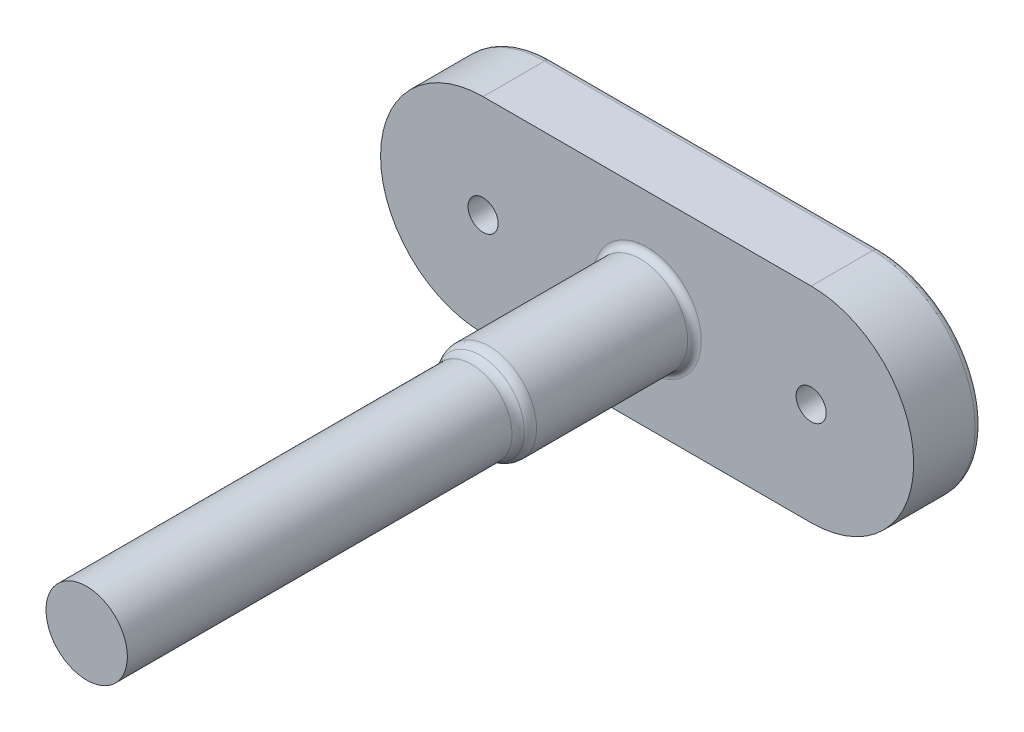
ISO-10303-21;
HEADER;
FILE_DESCRIPTION(('STEP AP214'),'2;1');
FILE_NAME('part.step','',(''),(''),'','','');
FILE_SCHEMA(('AUTOMOTIVE_DESIGN { 1 0 10303 214 1 1 1 1 }'));
ENDSEC;
DATA;
#1=APPLICATION_CONTEXT('core data for automotive mechanical design processes');
#2=APPLICATION_PROTOCOL_DEFINITION('international standard','automotive_design',2000,#1);
#3=PRODUCT_CONTEXT('',#1,'mechanical');
#4=PRODUCT('Part','Part','',(#3));
#5=PRODUCT_RELATED_PRODUCT_CATEGORY('part','',(#4));
#6=PRODUCT_DEFINITION_FORMATION('','',#4);
#7=PRODUCT_DEFINITION_CONTEXT('part definition',#1,'design');
#8=PRODUCT_DEFINITION('design','',#6,#7);
#9=PRODUCT_DEFINITION_SHAPE('','',#8);
#10=(LENGTH_UNIT() NAMED_UNIT(*) SI_UNIT(.MILLI.,.METRE.));
#11=(NAMED_UNIT(*) PLANE_ANGLE_UNIT() SI_UNIT($,.RADIAN.));
#12=(NAMED_UNIT(*) SI_UNIT($,.STERADIAN.) SOLID_ANGLE_UNIT());
#13=UNCERTAINTY_MEASURE_WITH_UNIT(LENGTH_MEASURE(1.E-05),#10,'distance_accuracy_value','');
#14=(GEOMETRIC_REPRESENTATION_CONTEXT(3) GLOBAL_UNCERTAINTY_ASSIGNED_CONTEXT((#13)) GLOBAL_UNIT_ASSIGNED_CONTEXT((#10,
#11,#12)) REPRESENTATION_CONTEXT('',''));
#15=CARTESIAN_POINT('',(0.,0.,0.));
#16=DIRECTION('',(0.,0.,1.));
#17=DIRECTION('',(1.,0.,0.));
#18=AXIS2_PLACEMENT_3D('',#15,#16,#17);
#19=CARTESIAN_POINT('',(0.,0.,10.));
#20=DIRECTION('',(0.,0.,1.));
#21=DIRECTION('',(1.,0.,0.));
#22=AXIS2_PLACEMENT_3D('',#19,#20,#21);
#23=PLANE('',#22);
#24=CARTESIAN_POINT('',(24.,0.,10.));
#25=DIRECTION('',(0.,0.,1.));
#26=DIRECTION('',(1.,0.,0.));
#27=AXIS2_PLACEMENT_3D('',#24,#25,#26);
#28=CIRCLE('',#27,7.925);
#29=CARTESIAN_POINT('',(31.925,0.,10.));
#30=VERTEX_POINT('',#29);
#31=EDGE_CURVE('E123',#30,#30,#28,.F.);
#32=ORIENTED_EDGE('',*,*,#31,.T.);
#33=EDGE_LOOP('',(#32));
#34=FACE_BOUND('',#33,.T.);
#35=CARTESIAN_POINT('',(0.,0.,10.));
#36=DIRECTION('',(0.,0.,1.));
#37=DIRECTION('',(1.,0.,0.));
#38=AXIS2_PLACEMENT_3D('',#35,#36,#37);
#39=CIRCLE('',#38,2.2);
#40=CARTESIAN_POINT('',(2.2,0.,10.));
#41=VERTEX_POINT('',#40);
#42=EDGE_CURVE('E103',#41,#41,#39,.T.);
#43=ORIENTED_EDGE('',*,*,#42,.F.);
#44=EDGE_LOOP('',(#43));
#45=FACE_BOUND('',#44,.T.);
#46=CARTESIAN_POINT('',(0.,0.,10.));
#47=DIRECTION('',(0.,0.,1.));
#48=DIRECTION('',(1.,0.,0.));
#49=AXIS2_PLACEMENT_3D('',#46,#47,#48);
#50=CIRCLE('',#49,15.);
#51=CARTESIAN_POINT('',(0.,15.,10.));
#52=VERTEX_POINT('',#51);
#53=CARTESIAN_POINT('',(0.,-15.,10.));
#54=VERTEX_POINT('',#53);
#55=EDGE_CURVE('E97',#52,#54,#50,.T.);
#56=ORIENTED_EDGE('',*,*,#55,.T.);
#57=DIRECTION('',(1.,0.,0.));
#58=VECTOR('',#57,1.);
#59=CARTESIAN_POINT('',(0.,-15.,10.));
#60=LINE('',#59,#58);
#61=CARTESIAN_POINT('',(48.,-15.,10.));
#62=VERTEX_POINT('',#61);
#63=EDGE_CURVE('E87',#54,#62,#60,.T.);
#64=ORIENTED_EDGE('',*,*,#63,.T.);
#65=CARTESIAN_POINT('',(48.,0.,10.));
#66=DIRECTION('',(0.,0.,1.));
#67=DIRECTION('',(1.,0.,0.));
#68=AXIS2_PLACEMENT_3D('',#65,#66,#67);
#69=CIRCLE('',#68,15.);
#70=CARTESIAN_POINT('',(48.,15.,10.));
#71=VERTEX_POINT('',#70);
#72=EDGE_CURVE('E96',#62,#71,#69,.T.);
#73=ORIENTED_EDGE('',*,*,#72,.T.);
#74=DIRECTION('',(-1.,0.,0.));
#75=VECTOR('',#74,1.);
#76=CARTESIAN_POINT('',(0.,15.,10.));
#77=LINE('',#76,#75);
#78=EDGE_CURVE('E102',#71,#52,#77,.T.);
#79=ORIENTED_EDGE('',*,*,#78,.T.);
#80=EDGE_LOOP('',(#56,#64,#73,#79));
#81=FACE_BOUND('',#80,.T.);
#82=CARTESIAN_POINT('',(48.,0.,10.));
#83=DIRECTION('',(0.,0.,1.));
#84=DIRECTION('',(1.,0.,0.));
#85=AXIS2_PLACEMENT_3D('',#82,#83,#84);
#86=CIRCLE('',#85,2.2);
#87=CARTESIAN_POINT('',(50.2,0.,10.));
#88=VERTEX_POINT('',#87);
#89=EDGE_CURVE('E160',#88,#88,#86,.T.);
#90=ORIENTED_EDGE('',*,*,#89,.F.);
#91=EDGE_LOOP('',(#90));
#92=FACE_BOUND('',#91,.T.);
#93=ADVANCED_FACE('F33',(#34,#45,#81,#92),#23,.T.);
#94=CARTESIAN_POINT('',(0.,0.,0.));
#95=DIRECTION('',(0.,0.,1.));
#96=DIRECTION('',(1.,0.,0.));
#97=AXIS2_PLACEMENT_3D('',#94,#95,#96);
#98=PLANE('',#97);
#99=DIRECTION('',(-1.,0.,0.));
#100=VECTOR('',#99,1.);
#101=CARTESIAN_POINT('',(0.,14.,0.));
#102=LINE('',#101,#100);
#103=CARTESIAN_POINT('',(0.,14.,0.));
#104=VERTEX_POINT('',#103);
#105=CARTESIAN_POINT('',(48.,14.,0.));
#106=VERTEX_POINT('',#105);
#107=EDGE_CURVE('E129',#104,#106,#102,.F.);
#108=ORIENTED_EDGE('',*,*,#107,.T.);
#109=CARTESIAN_POINT('',(48.,0.,0.));
#110=DIRECTION('',(0.,0.,1.));
#111=DIRECTION('',(1.,0.,0.));
#112=AXIS2_PLACEMENT_3D('',#109,#110,#111);
#113=CIRCLE('',#112,14.);
#114=CARTESIAN_POINT('',(48.,-14.,0.));
#115=VERTEX_POINT('',#114);
#116=EDGE_CURVE('E135',#106,#115,#113,.F.);
#117=ORIENTED_EDGE('',*,*,#116,.T.);
#118=DIRECTION('',(1.,0.,0.));
#119=VECTOR('',#118,1.);
#120=CARTESIAN_POINT('',(0.,-14.,0.));
#121=LINE('',#120,#119);
#122=CARTESIAN_POINT('',(0.,-14.,0.));
#123=VERTEX_POINT('',#122);
#124=EDGE_CURVE('E133',#115,#123,#121,.F.);
#125=ORIENTED_EDGE('',*,*,#124,.T.);
#126=CARTESIAN_POINT('',(0.,0.,0.));
#127=DIRECTION('',(0.,0.,1.));
#128=DIRECTION('',(1.,0.,0.));
#129=AXIS2_PLACEMENT_3D('',#126,#127,#128);
#130=CIRCLE('',#129,14.);
#131=EDGE_CURVE('E131',#123,#104,#130,.F.);
#132=ORIENTED_EDGE('',*,*,#131,.T.);
#133=EDGE_LOOP('',(#108,#117,#125,#132));
#134=FACE_BOUND('',#133,.T.);
#135=CARTESIAN_POINT('',(0.,0.,0.));
#136=DIRECTION('',(0.,0.,1.));
#137=DIRECTION('',(1.,0.,0.));
#138=AXIS2_PLACEMENT_3D('',#135,#136,#137);
#139=CIRCLE('',#138,2.2);
#140=CARTESIAN_POINT('',(2.2,0.,0.));
#141=VERTEX_POINT('',#140);
#142=EDGE_CURVE('E164',#141,#141,#139,.T.);
#143=ORIENTED_EDGE('',*,*,#142,.T.);
#144=EDGE_LOOP('',(#143));
#145=FACE_BOUND('',#144,.T.);
#146=CARTESIAN_POINT('',(48.,0.,0.));
#147=DIRECTION('',(0.,0.,1.));
#148=DIRECTION('',(1.,0.,0.));
#149=AXIS2_PLACEMENT_3D('',#146,#147,#148);
#150=CIRCLE('',#149,2.2);
#151=CARTESIAN_POINT('',(50.2,0.,0.));
#152=VERTEX_POINT('',#151);
#153=EDGE_CURVE('E155',#152,#152,#150,.T.);
#154=ORIENTED_EDGE('',*,*,#153,.T.);
#155=EDGE_LOOP('',(#154));
#156=FACE_BOUND('',#155,.T.);
#157=ADVANCED_FACE('F193',(#134,#145,#156),#98,.F.);
#158=CARTESIAN_POINT('',(0.,0.,10.));
#159=DIRECTION('',(0.,0.,-1.));
#160=DIRECTION('',(-1.,0.,0.));
#161=AXIS2_PLACEMENT_3D('',#158,#159,#160);
#162=CYLINDRICAL_SURFACE('',#161,15.);
#163=DIRECTION('',(0.,0.,-1.));
#164=VECTOR('',#163,1.);
#165=CARTESIAN_POINT('',(0.,15.,10.));
#166=LINE('',#165,#164);
#167=CARTESIAN_POINT('',(0.,15.,0.999999999999999));
#168=VERTEX_POINT('',#167);
#169=EDGE_CURVE('E172',#52,#168,#166,.T.);
#170=ORIENTED_EDGE('',*,*,#169,.T.);
#171=CARTESIAN_POINT('',(0.,0.,0.999999999999999));
#172=DIRECTION('',(0.,0.,1.));
#173=DIRECTION('',(1.,0.,0.));
#174=AXIS2_PLACEMENT_3D('',#171,#172,#173);
#175=CIRCLE('',#174,15.);
#176=CARTESIAN_POINT('',(0.,-15.,0.999999999999999));
#177=VERTEX_POINT('',#176);
#178=EDGE_CURVE('E42',#168,#177,#175,.T.);
#179=ORIENTED_EDGE('',*,*,#178,.T.);
#180=DIRECTION('',(0.,0.,-1.));
#181=VECTOR('',#180,1.);
#182=CARTESIAN_POINT('',(0.,-15.,10.));
#183=LINE('',#182,#181);
#184=EDGE_CURVE('E90',#54,#177,#183,.T.);
#185=ORIENTED_EDGE('',*,*,#184,.F.);
#186=ORIENTED_EDGE('',*,*,#55,.F.);
#187=EDGE_LOOP('',(#170,#179,#185,#186));
#188=FACE_BOUND('',#187,.T.);
#189=ADVANCED_FACE('F105',(#188),#162,.T.);
#190=CARTESIAN_POINT('',(0.,-15.,10.));
#191=DIRECTION('',(0.,1.,0.));
#192=DIRECTION('',(0.,0.,1.));
#193=AXIS2_PLACEMENT_3D('',#190,#191,#192);
#194=PLANE('',#193);
#195=ORIENTED_EDGE('',*,*,#184,.T.);
#196=DIRECTION('',(1.,0.,0.));
#197=VECTOR('',#196,1.);
#198=CARTESIAN_POINT('',(0.,-15.,0.999999999999999));
#199=LINE('',#198,#197);
#200=CARTESIAN_POINT('',(48.,-15.,0.999999999999999));
#201=VERTEX_POINT('',#200);
#202=EDGE_CURVE('E138',#177,#201,#199,.T.);
#203=ORIENTED_EDGE('',*,*,#202,.T.);
#204=DIRECTION('',(0.,0.,-1.));
#205=VECTOR('',#204,1.);
#206=CARTESIAN_POINT('',(48.,-15.,10.));
#207=LINE('',#206,#205);
#208=EDGE_CURVE('E93',#62,#201,#207,.T.);
#209=ORIENTED_EDGE('',*,*,#208,.F.);
#210=ORIENTED_EDGE('',*,*,#63,.F.);
#211=EDGE_LOOP('',(#195,#203,#209,#210));
#212=FACE_BOUND('',#211,.T.);
#213=ADVANCED_FACE('F89',(#212),#194,.F.);
#214=CARTESIAN_POINT('',(48.,0.,10.));
#215=DIRECTION('',(0.,0.,-1.));
#216=DIRECTION('',(-1.,0.,0.));
#217=AXIS2_PLACEMENT_3D('',#214,#215,#216);
#218=CYLINDRICAL_SURFACE('',#217,15.);
#219=ORIENTED_EDGE('',*,*,#208,.T.);
#220=CARTESIAN_POINT('',(48.,0.,0.999999999999999));
#221=DIRECTION('',(0.,0.,1.));
#222=DIRECTION('',(1.,0.,0.));
#223=AXIS2_PLACEMENT_3D('',#220,#221,#222);
#224=CIRCLE('',#223,15.);
#225=CARTESIAN_POINT('',(48.,15.,0.999999999999999));
#226=VERTEX_POINT('',#225);
#227=EDGE_CURVE('E126',#201,#226,#224,.T.);
#228=ORIENTED_EDGE('',*,*,#227,.T.);
#229=DIRECTION('',(0.,0.,-1.));
#230=VECTOR('',#229,1.);
#231=CARTESIAN_POINT('',(48.,15.,10.));
#232=LINE('',#231,#230);
#233=EDGE_CURVE('E111',#71,#226,#232,.T.);
#234=ORIENTED_EDGE('',*,*,#233,.F.);
#235=ORIENTED_EDGE('',*,*,#72,.F.);
#236=EDGE_LOOP('',(#219,#228,#234,#235));
#237=FACE_BOUND('',#236,.T.);
#238=ADVANCED_FACE('F176',(#237),#218,.T.);
#239=CARTESIAN_POINT('',(0.,15.,10.));
#240=DIRECTION('',(0.,-1.,0.));
#241=DIRECTION('',(0.,0.,-1.));
#242=AXIS2_PLACEMENT_3D('',#239,#240,#241);
#243=PLANE('',#242);
#244=ORIENTED_EDGE('',*,*,#233,.T.);
#245=DIRECTION('',(-1.,0.,0.));
#246=VECTOR('',#245,1.);
#247=CARTESIAN_POINT('',(0.,15.,0.999999999999999));
#248=LINE('',#247,#246);
#249=EDGE_CURVE('E11',#226,#168,#248,.T.);
#250=ORIENTED_EDGE('',*,*,#249,.T.);
#251=ORIENTED_EDGE('',*,*,#169,.F.);
#252=ORIENTED_EDGE('',*,*,#78,.F.);
#253=EDGE_LOOP('',(#244,#250,#251,#252));
#254=FACE_BOUND('',#253,.T.);
#255=ADVANCED_FACE('F174',(#254),#243,.F.);
#256=CARTESIAN_POINT('',(0.,0.,10.));
#257=DIRECTION('',(0.,0.,-1.));
#258=DIRECTION('',(-1.,0.,0.));
#259=AXIS2_PLACEMENT_3D('',#256,#257,#258);
#260=CYLINDRICAL_SURFACE('',#259,2.2);
#261=ORIENTED_EDGE('',*,*,#42,.T.);
#262=EDGE_LOOP('',(#261));
#263=FACE_BOUND('',#262,.T.);
#264=ORIENTED_EDGE('',*,*,#142,.F.);
#265=EDGE_LOOP('',(#264));
#266=FACE_BOUND('',#265,.T.);
#267=ADVANCED_FACE('F204',(#263,#266),#260,.F.);
#268=CARTESIAN_POINT('',(48.,0.,10.));
#269=DIRECTION('',(0.,0.,-1.));
#270=DIRECTION('',(-1.,0.,0.));
#271=AXIS2_PLACEMENT_3D('',#268,#269,#270);
#272=CYLINDRICAL_SURFACE('',#271,2.2);
#273=ORIENTED_EDGE('',*,*,#89,.T.);
#274=EDGE_LOOP('',(#273));
#275=FACE_BOUND('',#274,.T.);
#276=ORIENTED_EDGE('',*,*,#153,.F.);
#277=EDGE_LOOP('',(#276));
#278=FACE_BOUND('',#277,.T.);
#279=ADVANCED_FACE('F239',(#275,#278),#272,.F.);
#280=CARTESIAN_POINT('',(24.,0.,34.));
#281=DIRECTION('',(0.,0.,-1.));
#282=DIRECTION('',(-1.,0.,0.));
#283=AXIS2_PLACEMENT_3D('',#280,#281,#282);
#284=CYLINDRICAL_SURFACE('',#283,6.925);
#285=CARTESIAN_POINT('',(24.,0.,11.));
#286=DIRECTION('',(0.,0.,1.));
#287=DIRECTION('',(1.,0.,0.));
#288=AXIS2_PLACEMENT_3D('',#285,#286,#287);
#289=CIRCLE('',#288,6.925);
#290=CARTESIAN_POINT('',(30.925,0.,11.));
#291=VERTEX_POINT('',#290);
#292=EDGE_CURVE('E120',#291,#291,#289,.T.);
#293=ORIENTED_EDGE('',*,*,#292,.T.);
#294=EDGE_LOOP('',(#293));
#295=FACE_BOUND('',#294,.T.);
#296=CARTESIAN_POINT('',(24.,0.,33.1002433867352));
#297=DIRECTION('',(0.,0.,-1.));
#298=DIRECTION('',(-1.,0.,0.));
#299=AXIS2_PLACEMENT_3D('',#296,#297,#298);
#300=CIRCLE('',#299,6.925);
#301=CARTESIAN_POINT('',(17.075,0.,33.1002433867352));
#302=VERTEX_POINT('',#301);
#303=EDGE_CURVE('E117',#302,#302,#300,.T.);
#304=ORIENTED_EDGE('',*,*,#303,.T.);
#305=EDGE_LOOP('',(#304));
#306=FACE_BOUND('',#305,.T.);
#307=ADVANCED_FACE('F235',(#295,#306),#284,.T.);
#308=CARTESIAN_POINT('',(24.,0.,92.));
#309=DIRECTION('',(0.,0.,-1.));
#310=DIRECTION('',(-1.,0.,0.));
#311=AXIS2_PLACEMENT_3D('',#308,#309,#310);
#312=CYLINDRICAL_SURFACE('',#311,5.95);
#313=CARTESIAN_POINT('',(24.,0.,35.7173744495596));
#314=DIRECTION('',(0.,0.,-1.));
#315=DIRECTION('',(-1.,0.,0.));
#316=AXIS2_PLACEMENT_3D('',#313,#314,#315);
#317=CIRCLE('',#316,5.95);
#318=CARTESIAN_POINT('',(18.05,0.,35.7173744495596));
#319=VERTEX_POINT('',#318);
#320=EDGE_CURVE('E106',#319,#319,#317,.F.);
#321=CARTESIAN_POINT('',(24.,0.,92.));
#322=DIRECTION('',(0.,0.,1.));
#323=DIRECTION('',(1.,0.,0.));
#324=AXIS2_PLACEMENT_3D('',#321,#322,#323);
#325=CIRCLE('',#324,5.95);
#326=CARTESIAN_POINT('',(18.05,0.,92.));
#327=VERTEX_POINT('',#326);
#328=EDGE_CURVE('E150',#327,#327,#325,.T.);
#329=CARTESIAN_POINT('',(18.05,0.,35.7173744495596));
#330=CARTESIAN_POINT('',(18.05,0.,36.3036517990433));
#331=CARTESIAN_POINT('',(18.05,0.,36.8899291485271));
#332=CARTESIAN_POINT('',(18.05,0.,38.0624838474946));
#333=CARTESIAN_POINT('',(18.05,0.,38.6487611969783));
#334=CARTESIAN_POINT('',(18.05,0.,39.8213158959459));
#335=CARTESIAN_POINT('',(18.05,0.,40.4075932454296));
#336=CARTESIAN_POINT('',(18.05,0.,41.5801479443971));
#337=CARTESIAN_POINT('',(18.05,0.,42.1664252938809));
#338=CARTESIAN_POINT('',(18.05,0.,43.3389799928484));
#339=CARTESIAN_POINT('',(18.05,0.,43.9252573423321));
#340=CARTESIAN_POINT('',(18.05,0.,45.0978120412996));
#341=CARTESIAN_POINT('',(18.05,0.,45.6840893907834));
#342=CARTESIAN_POINT('',(18.05,0.,46.8566440897509));
#343=CARTESIAN_POINT('',(18.05,0.,47.4429214392347));
#344=CARTESIAN_POINT('',(18.05,0.,48.6154761382022));
#345=CARTESIAN_POINT('',(18.05,0.,49.2017534876859));
#346=CARTESIAN_POINT('',(18.05,0.,50.3743081866534));
#347=CARTESIAN_POINT('',(18.05,0.,50.9605855361372));
#348=CARTESIAN_POINT('',(18.05,0.,52.1331402351047));
#349=CARTESIAN_POINT('',(18.05,0.,52.7194175845884));
#350=CARTESIAN_POINT('',(18.05,0.,53.891972283556));
#351=CARTESIAN_POINT('',(18.05,0.,54.4782496330397));
#352=CARTESIAN_POINT('',(18.05,0.,55.6508043320072));
#353=CARTESIAN_POINT('',(18.05,0.,56.237081681491));
#354=CARTESIAN_POINT('',(18.05,0.,57.4096363804585));
#355=CARTESIAN_POINT('',(18.05,0.,57.9959137299422));
#356=CARTESIAN_POINT('',(18.05,0.,59.1684684289097));
#357=CARTESIAN_POINT('',(18.05,0.,59.7547457783935));
#358=CARTESIAN_POINT('',(18.05,0.,60.927300477361));
#359=CARTESIAN_POINT('',(18.05,0.,61.5135778268448));
#360=CARTESIAN_POINT('',(18.05,0.,62.6861325258123));
#361=CARTESIAN_POINT('',(18.05,0.,63.272409875296));
#362=CARTESIAN_POINT('',(18.05,0.,64.4449645742635));
#363=CARTESIAN_POINT('',(18.05,0.,65.0312419237473));
#364=CARTESIAN_POINT('',(18.05,0.,66.2037966227148));
#365=CARTESIAN_POINT('',(18.05,0.,66.7900739721986));
#366=CARTESIAN_POINT('',(18.05,0.,67.9626286711661));
#367=CARTESIAN_POINT('',(18.05,0.,68.5489060206498));
#368=CARTESIAN_POINT('',(18.05,0.,69.7214607196173));
#369=CARTESIAN_POINT('',(18.05,0.,70.3077380691011));
#370=CARTESIAN_POINT('',(18.05,0.,71.4802927680686));
#371=CARTESIAN_POINT('',(18.05,0.,72.0665701175523));
#372=CARTESIAN_POINT('',(18.05,0.,73.2391248165198));
#373=CARTESIAN_POINT('',(18.05,0.,73.8254021660036));
#374=CARTESIAN_POINT('',(18.05,0.,74.9979568649711));
#375=CARTESIAN_POINT('',(18.05,0.,75.5842342144549));
#376=CARTESIAN_POINT('',(18.05,0.,76.7567889134224));
#377=CARTESIAN_POINT('',(18.05,0.,77.3430662629061));
#378=CARTESIAN_POINT('',(18.05,0.,78.5156209618737));
#379=CARTESIAN_POINT('',(18.05,0.,79.1018983113574));
#380=CARTESIAN_POINT('',(18.05,0.,80.2744530103249));
#381=CARTESIAN_POINT('',(18.05,0.,80.8607303598087));
#382=CARTESIAN_POINT('',(18.05,0.,82.0332850587762));
#383=CARTESIAN_POINT('',(18.05,0.,82.6195624082599));
#384=CARTESIAN_POINT('',(18.05,0.,83.7921171072274));
#385=CARTESIAN_POINT('',(18.05,0.,84.3783944567112));
#386=CARTESIAN_POINT('',(18.05,0.,85.5509491556787));
#387=CARTESIAN_POINT('',(18.05,0.,86.1372265051624));
#388=CARTESIAN_POINT('',(18.05,0.,87.30978120413));
#389=CARTESIAN_POINT('',(18.05,0.,87.8960585536137));
#390=CARTESIAN_POINT('',(18.05,0.,89.0686132525812));
#391=CARTESIAN_POINT('',(18.05,0.,89.654890602065));
#392=CARTESIAN_POINT('',(18.05,0.,90.8274453010325));
#393=CARTESIAN_POINT('',(18.05,0.,91.4137226505162));
#394=CARTESIAN_POINT('',(18.05,0.,92.));
#395=B_SPLINE_CURVE_WITH_KNOTS('',3,(#329,#330,#331,#332,#333,#334,#335,#336,#337,#338,#339,
#340,#341,#342,#343,#344,#345,#346,#347,#348,#349,#350,#351,#352,#353,#354,#355,#356,#357,#358,
#359,#360,#361,#362,#363,#364,#365,#366,#367,#368,#369,#370,#371,#372,#373,#374,#375,#376,#377,
#378,#379,#380,#381,#382,#383,#384,#385,#386,#387,#388,#389,#390,#391,#392,#393,#394),
.UNSPECIFIED.,.F.,.F.,(4,2,2,2,2,2,2,2,2,2,2,2,2,2,2,2,2,2,2,2,2,2,2,2,2,2,2,2,2,2,2,2,4),(0.,
1.75883204845127,3.51766409690252,5.27649614535379,7.03532819380506,8.79416024225631,
10.5529922907076,12.3118243391588,14.0706563876101,15.8294884360614,17.5883204845126,
19.3471525329639,21.1059845814152,22.8648166298664,24.6236486783177,26.3824807267689,
28.1413127752202,29.9001448236715,31.6589768721227,33.417808920574,35.1766409690253,
36.9354730174765,38.6943050659278,40.4531371143791,42.2119691628303,43.9708012112816,
45.7296332597328,47.4884653081841,49.2472973566354,51.0061294050866,52.7649614535379,
54.5237935019892,56.2826255504404),.UNSPECIFIED.);
#396=EDGE_CURVE('BSEAM238',#319,#327,#395,.T.);
#397=ORIENTED_EDGE('',*,*,#320,.T.);
#398=ORIENTED_EDGE('',*,*,#328,.F.);
#399=ORIENTED_EDGE('',*,*,#396,.T.);
#400=ORIENTED_EDGE('',*,*,#396,.F.);
#401=EDGE_LOOP('',(#397,#399,#398,#400));
#402=FACE_BOUND('',#401,.T.);
#403=ADVANCED_FACE('F238',(#402),#312,.T.);
#404=CARTESIAN_POINT('',(24.,0.,92.));
#405=DIRECTION('',(0.,0.,1.));
#406=DIRECTION('',(1.,0.,0.));
#407=AXIS2_PLACEMENT_3D('',#404,#405,#406);
#408=PLANE('',#407);
#409=ORIENTED_EDGE('',*,*,#328,.T.);
#410=EDGE_LOOP('',(#409));
#411=FACE_BOUND('',#410,.T.);
#412=ADVANCED_FACE('F219',(#411),#408,.T.);
#413=CARTESIAN_POINT('',(24.,0.,35.7173744495596));
#414=DIRECTION('',(0.,0.,-1.));
#415=DIRECTION('',(-1.,0.,0.));
#416=AXIS2_PLACEMENT_3D('',#413,#414,#415);
#417=TOROIDAL_SURFACE('',#416,7.95,2.);
#418=CARTESIAN_POINT('',(24.,0.,34.4088089181474));
#419=DIRECTION('',(0.,0.,1.));
#420=DIRECTION('',(1.,0.,0.));
#421=AXIS2_PLACEMENT_3D('',#418,#419,#420);
#422=CIRCLE('',#421,6.4375);
#423=CARTESIAN_POINT('',(30.4375,0.,34.4088089181474));
#424=VERTEX_POINT('',#423);
#425=EDGE_CURVE('E109',#424,#424,#422,.T.);
#426=ORIENTED_EDGE('',*,*,#425,.T.);
#427=EDGE_LOOP('',(#426));
#428=FACE_BOUND('',#427,.T.);
#429=ORIENTED_EDGE('',*,*,#320,.F.);
#430=EDGE_LOOP('',(#429));
#431=FACE_BOUND('',#430,.T.);
#432=ADVANCED_FACE('F215',(#428,#431),#417,.F.);
#433=CARTESIAN_POINT('',(24.,0.,33.1002433867352));
#434=DIRECTION('',(0.,0.,-1.));
#435=DIRECTION('',(-1.,0.,0.));
#436=AXIS2_PLACEMENT_3D('',#433,#434,#435);
#437=TOROIDAL_SURFACE('',#436,4.925,2.);
#438=ORIENTED_EDGE('',*,*,#303,.F.);
#439=EDGE_LOOP('',(#438));
#440=FACE_BOUND('',#439,.T.);
#441=ORIENTED_EDGE('',*,*,#425,.F.);
#442=EDGE_LOOP('',(#441));
#443=FACE_BOUND('',#442,.T.);
#444=ADVANCED_FACE('F218',(#440,#443),#437,.T.);
#445=CARTESIAN_POINT('',(24.,0.,11.));
#446=DIRECTION('',(0.,0.,1.));
#447=DIRECTION('',(1.,0.,0.));
#448=AXIS2_PLACEMENT_3D('',#445,#446,#447);
#449=TOROIDAL_SURFACE('',#448,7.925,1.);
#450=ORIENTED_EDGE('',*,*,#31,.F.);
#451=EDGE_LOOP('',(#450));
#452=FACE_BOUND('',#451,.T.);
#453=ORIENTED_EDGE('',*,*,#292,.F.);
#454=EDGE_LOOP('',(#453));
#455=FACE_BOUND('',#454,.T.);
#456=ADVANCED_FACE('F223',(#452,#455),#449,.F.);
#457=CARTESIAN_POINT('',(0.,0.,0.999999999999999));
#458=DIRECTION('',(0.,0.,1.));
#459=DIRECTION('',(1.,0.,0.));
#460=AXIS2_PLACEMENT_3D('',#457,#458,#459);
#461=TOROIDAL_SURFACE('',#460,14.,1.);
#462=CARTESIAN_POINT('',(0.,14.,1.));
#463=DIRECTION('',(1.,0.,0.));
#464=DIRECTION('',(0.,0.,-1.));
#465=AXIS2_PLACEMENT_3D('',#462,#463,#464);
#466=CIRCLE('',#465,1.);
#467=EDGE_CURVE('E144',#104,#168,#466,.T.);
#468=ORIENTED_EDGE('',*,*,#467,.F.);
#469=ORIENTED_EDGE('',*,*,#131,.F.);
#470=CARTESIAN_POINT('',(0.,-14.,0.999999999999999));
#471=DIRECTION('',(1.,0.,0.));
#472=DIRECTION('',(0.,0.,-1.));
#473=AXIS2_PLACEMENT_3D('',#470,#471,#472);
#474=CIRCLE('',#473,1.);
#475=EDGE_CURVE('E37',#177,#123,#474,.T.);
#476=ORIENTED_EDGE('',*,*,#475,.F.);
#477=ORIENTED_EDGE('',*,*,#178,.F.);
#478=EDGE_LOOP('',(#468,#469,#476,#477));
#479=FACE_BOUND('',#478,.T.);
#480=ADVANCED_FACE('F35',(#479),#461,.T.);
#481=CARTESIAN_POINT('',(0.,-14.,0.999999999999999));
#482=DIRECTION('',(1.,0.,0.));
#483=DIRECTION('',(0.,0.,-1.));
#484=AXIS2_PLACEMENT_3D('',#481,#482,#483);
#485=CYLINDRICAL_SURFACE('',#484,1.);
#486=ORIENTED_EDGE('',*,*,#475,.T.);
#487=ORIENTED_EDGE('',*,*,#124,.F.);
#488=CARTESIAN_POINT('',(48.,-14.,0.999999999999999));
#489=DIRECTION('',(1.,0.,0.));
#490=DIRECTION('',(0.,0.,-1.));
#491=AXIS2_PLACEMENT_3D('',#488,#489,#490);
#492=CIRCLE('',#491,1.);
#493=EDGE_CURVE('E143',#201,#115,#492,.T.);
#494=ORIENTED_EDGE('',*,*,#493,.F.);
#495=ORIENTED_EDGE('',*,*,#202,.F.);
#496=EDGE_LOOP('',(#486,#487,#494,#495));
#497=FACE_BOUND('',#496,.T.);
#498=ADVANCED_FACE('F185',(#497),#485,.T.);
#499=CARTESIAN_POINT('',(0.,14.,0.999999999999999));
#500=DIRECTION('',(-1.,0.,0.));
#501=DIRECTION('',(0.,0.,1.));
#502=AXIS2_PLACEMENT_3D('',#499,#500,#501);
#503=CYLINDRICAL_SURFACE('',#502,1.);
#504=ORIENTED_EDGE('',*,*,#467,.T.);
#505=ORIENTED_EDGE('',*,*,#249,.F.);
#506=CARTESIAN_POINT('',(48.,14.,1.));
#507=DIRECTION('',(1.,0.,0.));
#508=DIRECTION('',(0.,0.,-1.));
#509=AXIS2_PLACEMENT_3D('',#506,#507,#508);
#510=CIRCLE('',#509,1.);
#511=EDGE_CURVE('E141',#106,#226,#510,.T.);
#512=ORIENTED_EDGE('',*,*,#511,.F.);
#513=ORIENTED_EDGE('',*,*,#107,.F.);
#514=EDGE_LOOP('',(#504,#505,#512,#513));
#515=FACE_BOUND('',#514,.T.);
#516=ADVANCED_FACE('F183',(#515),#503,.T.);
#517=CARTESIAN_POINT('',(48.,0.,0.999999999999999));
#518=DIRECTION('',(0.,0.,1.));
#519=DIRECTION('',(1.,0.,0.));
#520=AXIS2_PLACEMENT_3D('',#517,#518,#519);
#521=TOROIDAL_SURFACE('',#520,14.,1.);
#522=ORIENTED_EDGE('',*,*,#493,.T.);
#523=ORIENTED_EDGE('',*,*,#116,.F.);
#524=ORIENTED_EDGE('',*,*,#511,.T.);
#525=ORIENTED_EDGE('',*,*,#227,.F.);
#526=EDGE_LOOP('',(#522,#523,#524,#525));
#527=FACE_BOUND('',#526,.T.);
#528=ADVANCED_FACE('F180',(#527),#521,.T.);
#529=CLOSED_SHELL('',(#93,#157,#189,#213,#238,#255,#267,#279,#307,#403,#412,#432,#444,#456,#480,
#498,#516,#528));
#530=MANIFOLD_SOLID_BREP('B2',#529);
#531=ADVANCED_BREP_SHAPE_REPRESENTATION('',(#18,#530),#14);
#532=SHAPE_DEFINITION_REPRESENTATION(#9,#531);
ENDSEC;
END-ISO-10303-21;
